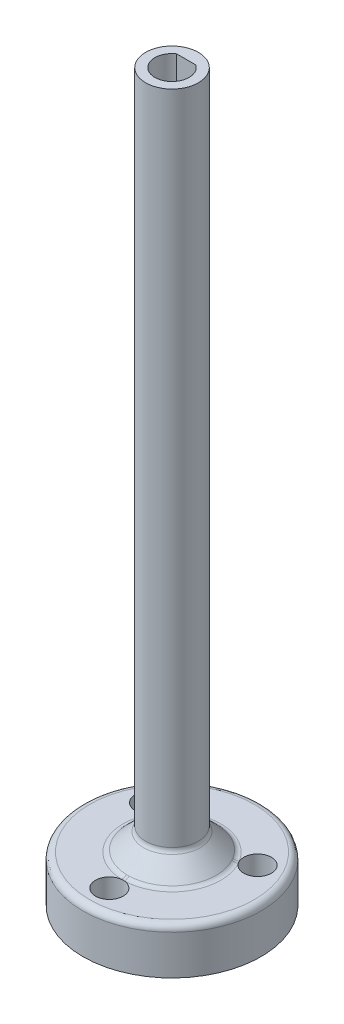
ISO-10303-21;
HEADER;
FILE_DESCRIPTION(('STEP AP214'),'2;1');
FILE_NAME('part.step','',(''),(''),'','','');
FILE_SCHEMA(('AUTOMOTIVE_DESIGN { 1 0 10303 214 1 1 1 1 }'));
ENDSEC;
DATA;
#1=APPLICATION_CONTEXT('core data for automotive mechanical design processes');
#2=APPLICATION_PROTOCOL_DEFINITION('international standard','automotive_design',2000,#1);
#3=PRODUCT_CONTEXT('',#1,'mechanical');
#4=PRODUCT('Part','Part','',(#3));
#5=PRODUCT_RELATED_PRODUCT_CATEGORY('part','',(#4));
#6=PRODUCT_DEFINITION_FORMATION('','',#4);
#7=PRODUCT_DEFINITION_CONTEXT('part definition',#1,'design');
#8=PRODUCT_DEFINITION('design','',#6,#7);
#9=PRODUCT_DEFINITION_SHAPE('','',#8);
#10=(LENGTH_UNIT() NAMED_UNIT(*) SI_UNIT(.MILLI.,.METRE.));
#11=(NAMED_UNIT(*) PLANE_ANGLE_UNIT() SI_UNIT($,.RADIAN.));
#12=(NAMED_UNIT(*) SI_UNIT($,.STERADIAN.) SOLID_ANGLE_UNIT());
#13=UNCERTAINTY_MEASURE_WITH_UNIT(LENGTH_MEASURE(1.E-05),#10,'distance_accuracy_value','');
#14=(GEOMETRIC_REPRESENTATION_CONTEXT(3) GLOBAL_UNCERTAINTY_ASSIGNED_CONTEXT((#13)) GLOBAL_UNIT_ASSIGNED_CONTEXT((#10,
#11,#12)) REPRESENTATION_CONTEXT('',''));
#15=CARTESIAN_POINT('',(0.,0.,0.));
#16=DIRECTION('',(0.,0.,1.));
#17=DIRECTION('',(1.,0.,0.));
#18=AXIS2_PLACEMENT_3D('',#15,#16,#17);
#19=CARTESIAN_POINT('',(-8.22724133595217,7.,-4.75));
#20=DIRECTION('',(0.,-1.,0.));
#21=DIRECTION('',(0.,0.,-1.));
#22=AXIS2_PLACEMENT_3D('',#19,#20,#21);
#23=CYLINDRICAL_SURFACE('',#22,2.1);
#24=CARTESIAN_POINT('',(-8.22724133595217,7.,-4.75));
#25=DIRECTION('',(0.,1.,0.));
#26=DIRECTION('',(0.,0.,1.));
#27=AXIS2_PLACEMENT_3D('',#24,#25,#26);
#28=CIRCLE('',#27,2.1);
#29=CARTESIAN_POINT('',(-6.52591505913718,7.,-3.51894805153525));
#30=VERTEX_POINT('',#29);
#31=CARTESIAN_POINT('',(-6.31045593679587,7.,-3.89213419838459));
#32=VERTEX_POINT('',#31);
#33=EDGE_CURVE('E166',#30,#32,#28,.T.);
#34=ORIENTED_EDGE('',*,*,#33,.T.);
#35=EDGE_CURVE('E165',#32,#30,#28,.T.);
#36=ORIENTED_EDGE('',*,*,#35,.T.);
#37=EDGE_LOOP('',(#34,#36));
#38=FACE_BOUND('',#37,.T.);
#39=CARTESIAN_POINT('',(-8.22724133595217,0.,-4.75));
#40=DIRECTION('',(0.,1.,0.));
#41=DIRECTION('',(0.,0.,1.));
#42=AXIS2_PLACEMENT_3D('',#39,#40,#41);
#43=CIRCLE('',#42,2.1);
#44=CARTESIAN_POINT('',(-8.22724133595217,0.,-2.65));
#45=VERTEX_POINT('',#44);
#46=EDGE_CURVE('E178',#45,#45,#43,.T.);
#47=ORIENTED_EDGE('',*,*,#46,.F.);
#48=EDGE_LOOP('',(#47));
#49=FACE_BOUND('',#48,.T.);
#50=ADVANCED_FACE('F45',(#38,#49),#23,.F.);
#51=CARTESIAN_POINT('',(8.22724133595217,7.,-4.75000000000001));
#52=DIRECTION('',(0.,-1.,0.));
#53=DIRECTION('',(0.,0.,-1.));
#54=AXIS2_PLACEMENT_3D('',#51,#52,#53);
#55=CYLINDRICAL_SURFACE('',#54,2.1);
#56=CARTESIAN_POINT('',(8.22724133595217,7.,-4.75000000000001));
#57=DIRECTION('',(0.,1.,0.));
#58=DIRECTION('',(0.,0.,1.));
#59=AXIS2_PLACEMENT_3D('',#56,#57,#58);
#60=CIRCLE('',#59,2.1);
#61=CARTESIAN_POINT('',(6.31045593679588,7.,-3.89213419838458));
#62=VERTEX_POINT('',#61);
#63=CARTESIAN_POINT('',(6.52591505913716,7.,-3.51894805153528));
#64=VERTEX_POINT('',#63);
#65=EDGE_CURVE('E161',#62,#64,#60,.T.);
#66=ORIENTED_EDGE('',*,*,#65,.T.);
#67=EDGE_CURVE('E159',#64,#62,#60,.T.);
#68=ORIENTED_EDGE('',*,*,#67,.T.);
#69=EDGE_LOOP('',(#66,#68));
#70=FACE_BOUND('',#69,.T.);
#71=CARTESIAN_POINT('',(8.22724133595217,0.,-4.75000000000001));
#72=DIRECTION('',(0.,1.,0.));
#73=DIRECTION('',(0.,0.,1.));
#74=AXIS2_PLACEMENT_3D('',#71,#72,#73);
#75=CIRCLE('',#74,2.1);
#76=CARTESIAN_POINT('',(8.22724133595217,0.,-2.65000000000001));
#77=VERTEX_POINT('',#76);
#78=EDGE_CURVE('E174',#77,#77,#75,.T.);
#79=ORIENTED_EDGE('',*,*,#78,.F.);
#80=EDGE_LOOP('',(#79));
#81=FACE_BOUND('',#80,.T.);
#82=ADVANCED_FACE('F380',(#70,#81),#55,.F.);
#83=CARTESIAN_POINT('',(0.,7.,9.5));
#84=DIRECTION('',(0.,-1.,0.));
#85=DIRECTION('',(0.,0.,-1.));
#86=AXIS2_PLACEMENT_3D('',#83,#84,#85);
#87=CYLINDRICAL_SURFACE('',#86,2.1);
#88=CARTESIAN_POINT('',(0.,7.,9.5));
#89=DIRECTION('',(0.,1.,0.));
#90=DIRECTION('',(0.,0.,1.));
#91=AXIS2_PLACEMENT_3D('',#88,#89,#90);
#92=CIRCLE('',#91,2.1);
#93=CARTESIAN_POINT('',(0.215459122341307,7.,7.41108224991985));
#94=VERTEX_POINT('',#93);
#95=CARTESIAN_POINT('',(-0.215459122341307,7.,7.41108224991985));
#96=VERTEX_POINT('',#95);
#97=EDGE_CURVE('E155',#94,#96,#92,.T.);
#98=ORIENTED_EDGE('',*,*,#97,.T.);
#99=EDGE_CURVE('E160',#96,#94,#92,.T.);
#100=ORIENTED_EDGE('',*,*,#99,.T.);
#101=EDGE_LOOP('',(#98,#100));
#102=FACE_BOUND('',#101,.T.);
#103=CARTESIAN_POINT('',(0.,0.,9.5));
#104=DIRECTION('',(0.,1.,0.));
#105=DIRECTION('',(0.,0.,1.));
#106=AXIS2_PLACEMENT_3D('',#103,#104,#105);
#107=CIRCLE('',#106,2.1);
#108=CARTESIAN_POINT('',(0.,0.,11.6));
#109=VERTEX_POINT('',#108);
#110=EDGE_CURVE('E154',#109,#109,#107,.T.);
#111=ORIENTED_EDGE('',*,*,#110,.F.);
#112=EDGE_LOOP('',(#111));
#113=FACE_BOUND('',#112,.T.);
#114=ADVANCED_FACE('F387',(#102,#113),#87,.F.);
#115=CARTESIAN_POINT('',(0.,7.,0.));
#116=DIRECTION('',(0.,-1.,0.));
#117=DIRECTION('',(0.,0.,-1.));
#118=AXIS2_PLACEMENT_3D('',#115,#116,#117);
#119=CYLINDRICAL_SURFACE('',#118,13.5);
#120=CARTESIAN_POINT('',(0.,6.,0.));
#121=DIRECTION('',(0.,1.,0.));
#122=DIRECTION('',(0.,0.,1.));
#123=AXIS2_PLACEMENT_3D('',#120,#121,#122);
#124=CIRCLE('',#123,13.5);
#125=CARTESIAN_POINT('',(0.,6.,13.5));
#126=VERTEX_POINT('',#125);
#127=EDGE_CURVE('E198',#126,#126,#124,.F.);
#128=ORIENTED_EDGE('',*,*,#127,.T.);
#129=EDGE_LOOP('',(#128));
#130=FACE_BOUND('',#129,.T.);
#131=CARTESIAN_POINT('',(0.,0.,0.));
#132=DIRECTION('',(0.,1.,0.));
#133=DIRECTION('',(0.,0.,1.));
#134=AXIS2_PLACEMENT_3D('',#131,#132,#133);
#135=CIRCLE('',#134,13.5);
#136=CARTESIAN_POINT('',(0.,0.,13.5));
#137=VERTEX_POINT('',#136);
#138=EDGE_CURVE('E182',#137,#137,#135,.T.);
#139=ORIENTED_EDGE('',*,*,#138,.T.);
#140=EDGE_LOOP('',(#139));
#141=FACE_BOUND('',#140,.T.);
#142=ADVANCED_FACE('F425',(#130,#141),#119,.T.);
#143=CARTESIAN_POINT('',(0.,7.,0.));
#144=DIRECTION('',(0.,1.,0.));
#145=DIRECTION('',(0.,0.,1.));
#146=AXIS2_PLACEMENT_3D('',#143,#144,#145);
#147=PLANE('',#146);
#148=CARTESIAN_POINT('',(0.,7.,0.));
#149=DIRECTION('',(0.,1.,0.));
#150=DIRECTION('',(0.,0.,1.));
#151=AXIS2_PLACEMENT_3D('',#148,#149,#150);
#152=CIRCLE('',#151,12.5);
#153=CARTESIAN_POINT('',(0.,7.,12.5));
#154=VERTEX_POINT('',#153);
#155=EDGE_CURVE('E194',#154,#154,#152,.T.);
#156=ORIENTED_EDGE('',*,*,#155,.T.);
#157=EDGE_LOOP('',(#156));
#158=FACE_BOUND('',#157,.T.);
#159=ORIENTED_EDGE('',*,*,#99,.F.);
#160=CARTESIAN_POINT('',(0.,7.,0.));
#161=DIRECTION('',(0.,1.,0.));
#162=DIRECTION('',(0.,0.,1.));
#163=AXIS2_PLACEMENT_3D('',#160,#161,#162);
#164=CIRCLE('',#163,7.4142135623731);
#165=EDGE_CURVE('E191',#96,#30,#164,.F.);
#166=ORIENTED_EDGE('',*,*,#165,.T.);
#167=ORIENTED_EDGE('',*,*,#35,.F.);
#168=CARTESIAN_POINT('',(0.,7.,0.));
#169=DIRECTION('',(0.,1.,0.));
#170=DIRECTION('',(0.,0.,1.));
#171=AXIS2_PLACEMENT_3D('',#168,#169,#170);
#172=CIRCLE('',#171,7.4142135623731);
#173=EDGE_CURVE('E188',#32,#62,#172,.F.);
#174=ORIENTED_EDGE('',*,*,#173,.T.);
#175=ORIENTED_EDGE('',*,*,#67,.F.);
#176=CARTESIAN_POINT('',(0.,7.,0.));
#177=DIRECTION('',(0.,1.,0.));
#178=DIRECTION('',(0.,0.,1.));
#179=AXIS2_PLACEMENT_3D('',#176,#177,#178);
#180=CIRCLE('',#179,7.4142135623731);
#181=EDGE_CURVE('E170',#64,#94,#180,.F.);
#182=ORIENTED_EDGE('',*,*,#181,.T.);
#183=EDGE_LOOP('',(#159,#166,#167,#174,#175,#182));
#184=FACE_BOUND('',#183,.T.);
#185=ADVANCED_FACE('F377',(#158,#184),#147,.T.);
#186=CARTESIAN_POINT('',(0.,0.,0.));
#187=DIRECTION('',(0.,1.,0.));
#188=DIRECTION('',(0.,0.,1.));
#189=AXIS2_PLACEMENT_3D('',#186,#187,#188);
#190=PLANE('',#189);
#191=ORIENTED_EDGE('',*,*,#110,.T.);
#192=EDGE_LOOP('',(#191));
#193=FACE_BOUND('',#192,.T.);
#194=ORIENTED_EDGE('',*,*,#78,.T.);
#195=EDGE_LOOP('',(#194));
#196=FACE_BOUND('',#195,.T.);
#197=ORIENTED_EDGE('',*,*,#46,.T.);
#198=EDGE_LOOP('',(#197));
#199=FACE_BOUND('',#198,.T.);
#200=ORIENTED_EDGE('',*,*,#138,.F.);
#201=EDGE_LOOP('',(#200));
#202=FACE_BOUND('',#201,.T.);
#203=ADVANCED_FACE('F437',(#193,#196,#199,#202),#190,.F.);
#204=CARTESIAN_POINT('',(0.,110.,0.));
#205=DIRECTION('',(0.,-1.,0.));
#206=DIRECTION('',(0.,0.,-1.));
#207=AXIS2_PLACEMENT_3D('',#204,#205,#206);
#208=CYLINDRICAL_SURFACE('',#207,4.);
#209=CARTESIAN_POINT('',(0.,10.4142135623731,0.));
#210=DIRECTION('',(0.,1.,0.));
#211=DIRECTION('',(0.,0.,1.));
#212=AXIS2_PLACEMENT_3D('',#209,#210,#211);
#213=CIRCLE('',#212,4.);
#214=CARTESIAN_POINT('',(0.,10.4142135623731,4.));
#215=VERTEX_POINT('',#214);
#216=EDGE_CURVE('E332',#215,#215,#213,.T.);
#217=ORIENTED_EDGE('',*,*,#216,.T.);
#218=EDGE_LOOP('',(#217));
#219=FACE_BOUND('',#218,.T.);
#220=CARTESIAN_POINT('',(0.,110.,0.));
#221=DIRECTION('',(0.,1.,0.));
#222=DIRECTION('',(0.,0.,1.));
#223=AXIS2_PLACEMENT_3D('',#220,#221,#222);
#224=CIRCLE('',#223,4.);
#225=CARTESIAN_POINT('',(0.,110.,4.));
#226=VERTEX_POINT('',#225);
#227=EDGE_CURVE('E131',#226,#226,#224,.T.);
#228=ORIENTED_EDGE('',*,*,#227,.F.);
#229=EDGE_LOOP('',(#228));
#230=FACE_BOUND('',#229,.T.);
#231=ADVANCED_FACE('F444',(#219,#230),#208,.T.);
#232=CARTESIAN_POINT('',(0.,110.,0.));
#233=DIRECTION('',(0.,1.,0.));
#234=DIRECTION('',(0.,0.,1.));
#235=AXIS2_PLACEMENT_3D('',#232,#233,#234);
#236=PLANE('',#235);
#237=CARTESIAN_POINT('',(0.,110.,0.));
#238=DIRECTION('',(0.,1.,0.));
#239=DIRECTION('',(0.,0.,1.));
#240=AXIS2_PLACEMENT_3D('',#237,#238,#239);
#241=CIRCLE('',#240,2.6);
#242=CARTESIAN_POINT('',(-1.46201915172134,110.,-2.15));
#243=VERTEX_POINT('',#242);
#244=CARTESIAN_POINT('',(1.46201915172134,110.,-2.15));
#245=VERTEX_POINT('',#244);
#246=EDGE_CURVE('E126',#243,#245,#241,.T.);
#247=ORIENTED_EDGE('',*,*,#246,.F.);
#248=DIRECTION('',(-1.,0.,0.));
#249=VECTOR('',#248,1.);
#250=CARTESIAN_POINT('',(-1.46201915172134,110.,-2.15));
#251=LINE('',#250,#249);
#252=EDGE_CURVE('E134',#245,#243,#251,.T.);
#253=ORIENTED_EDGE('',*,*,#252,.F.);
#254=EDGE_LOOP('',(#247,#253));
#255=FACE_BOUND('',#254,.T.);
#256=ORIENTED_EDGE('',*,*,#227,.T.);
#257=EDGE_LOOP('',(#256));
#258=FACE_BOUND('',#257,.T.);
#259=ADVANCED_FACE('F139',(#255,#258),#236,.T.);
#260=CARTESIAN_POINT('',(0.,93.,0.));
#261=DIRECTION('',(0.,1.,0.));
#262=DIRECTION('',(0.,0.,1.));
#263=AXIS2_PLACEMENT_3D('',#260,#261,#262);
#264=CYLINDRICAL_SURFACE('',#263,2.6);
#265=DIRECTION('',(0.,1.,0.));
#266=VECTOR('',#265,1.);
#267=CARTESIAN_POINT('',(1.46201915172134,93.,-2.15));
#268=LINE('',#267,#266);
#269=CARTESIAN_POINT('',(1.46201915172134,95.,-2.15));
#270=VERTEX_POINT('',#269);
#271=EDGE_CURVE('E132',#270,#245,#268,.T.);
#272=ORIENTED_EDGE('',*,*,#271,.F.);
#273=CARTESIAN_POINT('',(0.,95.,0.));
#274=DIRECTION('',(0.,1.,0.));
#275=DIRECTION('',(0.,0.,1.));
#276=AXIS2_PLACEMENT_3D('',#273,#274,#275);
#277=CIRCLE('',#276,2.6);
#278=CARTESIAN_POINT('',(-1.46201915172134,95.,-2.15));
#279=VERTEX_POINT('',#278);
#280=EDGE_CURVE('E11',#270,#279,#277,.F.);
#281=ORIENTED_EDGE('',*,*,#280,.T.);
#282=DIRECTION('',(0.,1.,0.));
#283=VECTOR('',#282,1.);
#284=CARTESIAN_POINT('',(-1.46201915172134,93.,-2.15));
#285=LINE('',#284,#283);
#286=EDGE_CURVE('E122',#279,#243,#285,.T.);
#287=ORIENTED_EDGE('',*,*,#286,.T.);
#288=ORIENTED_EDGE('',*,*,#246,.T.);
#289=EDGE_LOOP('',(#272,#281,#287,#288));
#290=FACE_BOUND('',#289,.T.);
#291=ADVANCED_FACE('F124',(#290),#264,.F.);
#292=CARTESIAN_POINT('',(-1.46201915172134,93.,-2.15));
#293=DIRECTION('',(0.,0.,-1.));
#294=DIRECTION('',(-1.,0.,0.));
#295=AXIS2_PLACEMENT_3D('',#292,#293,#294);
#296=PLANE('',#295);
#297=ORIENTED_EDGE('',*,*,#286,.F.);
#298=DIRECTION('',(1.,0.,0.));
#299=VECTOR('',#298,1.);
#300=CARTESIAN_POINT('',(-1.46201915172134,95.,-2.15));
#301=LINE('',#300,#299);
#302=EDGE_CURVE('E61',#279,#270,#301,.T.);
#303=ORIENTED_EDGE('',*,*,#302,.T.);
#304=ORIENTED_EDGE('',*,*,#271,.T.);
#305=ORIENTED_EDGE('',*,*,#252,.T.);
#306=EDGE_LOOP('',(#297,#303,#304,#305));
#307=FACE_BOUND('',#306,.T.);
#308=ADVANCED_FACE('F135',(#307),#296,.F.);
#309=CARTESIAN_POINT('',(0.,93.,0.));
#310=DIRECTION('',(0.,1.,0.));
#311=DIRECTION('',(0.,0.,1.));
#312=AXIS2_PLACEMENT_3D('',#309,#310,#311);
#313=PLANE('',#312);
#314=CARTESIAN_POINT('',(0.,93.,0.));
#315=DIRECTION('',(0.,1.,0.));
#316=DIRECTION('',(0.,0.,1.));
#317=AXIS2_PLACEMENT_3D('',#314,#315,#316);
#318=CIRCLE('',#317,0.599999999999989);
#319=CARTESIAN_POINT('',(-0.580947501931104,93.,-0.14999999999999));
#320=VERTEX_POINT('',#319);
#321=CARTESIAN_POINT('',(0.580947501931104,93.,-0.14999999999999));
#322=VERTEX_POINT('',#321);
#323=EDGE_CURVE('E302',#320,#322,#318,.T.);
#324=ORIENTED_EDGE('',*,*,#323,.T.);
#325=DIRECTION('',(-1.,0.,0.));
#326=VECTOR('',#325,1.);
#327=CARTESIAN_POINT('',(0.,93.,-0.14999999999999));
#328=LINE('',#327,#326);
#329=EDGE_CURVE('E327',#322,#320,#328,.T.);
#330=ORIENTED_EDGE('',*,*,#329,.T.);
#331=EDGE_LOOP('',(#324,#330));
#332=FACE_BOUND('',#331,.T.);
#333=ADVANCED_FACE('F410',(#332),#313,.T.);
#334=CARTESIAN_POINT('',(0.,10.,0.));
#335=DIRECTION('',(0.,-1.,0.));
#336=DIRECTION('',(0.,0.,-1.));
#337=AXIS2_PLACEMENT_3D('',#334,#335,#336);
#338=CONICAL_SURFACE('',#337,4.,0.785398163397442);
#339=CARTESIAN_POINT('',(0.964392071070711,7.,7.63453814478667));
#340=CARTESIAN_POINT('',(0.940532110188587,6.8546779710934,7.08404741665626));
#341=CARTESIAN_POINT('',(0.993851498928227,7.24966295601321,6.67677387706806));
#342=CARTESIAN_POINT('',(0.939082338416927,7.,7.62145551529444));
#343=CARTESIAN_POINT('',(0.914917325744151,6.8645663279993,7.07731076934834));
#344=CARTESIAN_POINT('',(0.960617892757036,7.25483919760367,6.67648809214324));
#345=CARTESIAN_POINT('',(0.913030160219413,7.,7.60863828458851));
#346=CARTESIAN_POINT('',(0.88844095042153,6.87407031500396,7.07098239734326));
#347=CARTESIAN_POINT('',(0.92733125811109,7.25941775065054,6.67657110362549));
#348=CARTESIAN_POINT('',(0.859405569203017,7.,7.58367585865176));
#349=CARTESIAN_POINT('',(0.834053692634578,6.89215530304134,7.05918543886975));
#350=CARTESIAN_POINT('',(0.860699646128984,7.26749585495772,6.6773422732741));
#351=CARTESIAN_POINT('',(0.831833762021651,7.,7.57153039950276));
#352=CARTESIAN_POINT('',(0.806143549122456,6.90074634958733,7.05370840519843));
#353=CARTESIAN_POINT('',(0.827354697091079,7.27099583246315,6.67803019197036));
#354=CARTESIAN_POINT('',(0.746861309748615,7.,7.53634208754119));
#355=CARTESIAN_POINT('',(0.720741381883771,6.92495083085154,7.03859250005324));
#356=CARTESIAN_POINT('',(0.727389397896839,7.28004637042288,6.6807995102541));
#357=CARTESIAN_POINT('',(0.687109157966461,7.,7.51449728064184));
#358=CARTESIAN_POINT('',(0.660901836105139,6.93924887044047,7.03010051715558));
#359=CARTESIAN_POINT('',(0.66071384834035,7.28416603416479,6.68358639626018));
#360=CARTESIAN_POINT('',(0.561594479589067,7.,7.47542300631635));
#361=CARTESIAN_POINT('',(0.536814808875337,6.96363756519083,7.01613295777335));
#362=CARTESIAN_POINT('',(0.527547947642192,7.28973784129046,6.68982345549574));
#363=CARTESIAN_POINT('',(0.495850145703401,7.,7.45818015456587));
#364=CARTESIAN_POINT('',(0.47247749425604,6.9738140265515,7.01060008892335));
#365=CARTESIAN_POINT('',(0.461057628520458,7.29119779395776,6.69327165395947));
#366=CARTESIAN_POINT('',(0.35907834535312,7.,7.42975257120324));
#367=CARTESIAN_POINT('',(0.340366619795047,6.98997529996355,7.00206100798164));
#368=CARTESIAN_POINT('',(0.328024357396843,7.29277524530763,6.69952973450763));
#369=CARTESIAN_POINT('',(0.288049767910334,7.,7.41856911765748));
#370=CARTESIAN_POINT('',(0.272403067798783,6.99601734798804,6.99902225515107));
#371=CARTESIAN_POINT('',(0.261481397253549,7.29289246088099,6.70233948185553));
#372=CARTESIAN_POINT('',(0.151540897340339,7.,7.40448983993549));
#373=CARTESIAN_POINT('',(0.142908602561365,7.0034937637638,6.99530788228604));
#374=CARTESIAN_POINT('',(0.136292687711151,7.29289388619522,6.70597760226659));
#375=CARTESIAN_POINT('',(0.0864115551324169,7.,7.40076351117429));
#376=CARTESIAN_POINT('',(0.0814147585385162,7.00541447118292,6.99438211212521));
#377=CARTESIAN_POINT('',(0.0776532370722739,7.29280426025577,6.70700258726048));
#378=CARTESIAN_POINT('',(-0.0440911627339864,7.,7.39944971034132));
#379=CARTESIAN_POINT('',(-0.0415270682911661,7.00609537492484,6.99405117420053));
#380=CARTESIAN_POINT('',(-0.0396274419809167,7.29278114017805,6.70735811640296));
#381=CARTESIAN_POINT('',(-0.109464521048752,7.,7.40186180996846));
#382=CARTESIAN_POINT('',(-0.103174539623916,7.00485799464258,6.99464483506416));
#383=CARTESIAN_POINT('',(-0.0982686699857281,7.29284763514661,6.70668877877078));
#384=CARTESIAN_POINT('',(-0.238204997632121,7.,7.41255269912608));
#385=CARTESIAN_POINT('',(-0.224985847829216,6.99922980160129,6.99741968763948));
#386=CARTESIAN_POINT('',(-0.215493067573421,7.2929137268914,6.70387988211979));
#387=CARTESIAN_POINT('',(-0.301572749961868,7.,7.42082961477724));
#388=CARTESIAN_POINT('',(-0.285336251174129,6.99482224246639,6.99960921850319));
#389=CARTESIAN_POINT('',(-0.27407624971714,7.29291334502599,6.70174079271098));
#390=CARTESIAN_POINT('',(-0.424664644222314,7.,7.44243504780572));
#391=CARTESIAN_POINT('',(-0.403454747049731,6.9828421602968,7.00580086606958));
#392=CARTESIAN_POINT('',(-0.391220347553087,7.29216596294367,6.69667245705004));
#393=CARTESIAN_POINT('',(-0.484387802982984,7.,7.45576492134256));
#394=CARTESIAN_POINT('',(-0.461368331777474,6.97523403086884,7.00982246112346));
#395=CARTESIAN_POINT('',(-0.449781253039109,7.29141876220041,6.69374299873229));
#396=CARTESIAN_POINT('',(-0.5996800091924,7.,7.48655134938539));
#397=CARTESIAN_POINT('',(-0.574211254090877,6.95680848325585,7.02000209236644));
#398=CARTESIAN_POINT('',(-0.567309388710926,7.28829339880792,6.68794794295523));
#399=CARTESIAN_POINT('',(-0.655216226033752,7.,7.50403678753922));
#400=CARTESIAN_POINT('',(-0.62921074221499,6.94592147062308,7.02620429313583));
#401=CARTESIAN_POINT('',(-0.626276523826103,7.28590358855339,6.68508295345722));
#402=CARTESIAN_POINT('',(-0.761330809039517,7.,7.54205445056581));
#403=CARTESIAN_POINT('',(-0.735168253128472,6.92107950248601,7.04100052272153));
#404=CARTESIAN_POINT('',(-0.744131217351407,7.2786155610104,6.68032494548362));
#405=CARTESIAN_POINT('',(-0.811912467228869,7.,7.56258462926299));
#406=CARTESIAN_POINT('',(-0.78617776375319,6.90707275055508,7.04963098698742));
#407=CARTESIAN_POINT('',(-0.803018802606971,7.27371902295629,6.67843127802608));
#408=CARTESIAN_POINT('',(-0.908398683643013,7.,7.60589744467528));
#409=CARTESIAN_POINT('',(-0.883891177588462,6.87616474649766,7.06951503888091));
#410=CARTESIAN_POINT('',(-0.920813141430025,7.2606465421496,6.67640732552143));
#411=CARTESIAN_POINT('',(-0.95428832646702,7.,7.62868683702746));
#412=CARTESIAN_POINT('',(-0.930584750400519,6.85920102814364,7.08082056545844));
#413=CARTESIAN_POINT('',(-0.979719393330013,7.25246052568087,6.67628250036391));
#414=CARTESIAN_POINT('',(-1.04163813765772,7.,7.67587307259055));
#415=CARTESIAN_POINT('',(-1.01925859123222,6.82273451613959,7.10613645902736));
#416=CARTESIAN_POINT('',(-1.09722421004048,7.2322374638015,6.67848046599306));
#417=CARTESIAN_POINT('',(-1.08308720295185,7.,7.70027370935831));
#418=CARTESIAN_POINT('',(-1.06119756962471,6.80317645128842,7.1202004000535));
#419=CARTESIAN_POINT('',(-1.15582167058219,7.22019105264382,6.6808092412515));
#420=CARTESIAN_POINT('',(-1.12241801329154,7.,7.72512597533271));
#421=CARTESIAN_POINT('',(-1.10016930486776,6.78272593576934,7.13552863825325));
#422=CARTESIAN_POINT('',(-1.2140474808745,7.20594663198824,6.68470267712591));
#423=(BOUNDED_SURFACE() B_SPLINE_SURFACE(3,2,((#339,#340,#341),(#342,#343,#344),(#345,#346,
#347),(#348,#349,#350),(#351,#352,#353),(#354,#355,#356),(#357,#358,#359),(#360,#361,#362),
(#363,#364,#365),(#366,#367,#368),(#369,#370,#371),(#372,#373,#374),(#375,#376,#377),(#378,#379,
#380),(#381,#382,#383),(#384,#385,#386),(#387,#388,#389),(#390,#391,#392),(#393,#394,#395),
(#396,#397,#398),(#399,#400,#401),(#402,#403,#404),(#405,#406,#407),(#408,#409,#410),(#411,#412,
#413),(#414,#415,#416),(#417,#418,#419),(#420,#421,#422)),.UNSPECIFIED.,.F.,.F.,
.F.) B_SPLINE_SURFACE_WITH_KNOTS((4,2,2,2,2,2,2,2,2,2,2,2,2,4),(3,3),(0.,0.11098229509543,
0.221920674391029,0.443381708865098,0.66419144829289,0.885047743458971,1.0795181859593,
1.27397505990184,1.46836983053275,1.66281681161086,1.8586570200029,2.05436620814021,
2.25067936115262,2.44747244406206),(0.,1.),
.UNSPECIFIED.) GEOMETRIC_REPRESENTATION_ITEM() RATIONAL_B_SPLINE_SURFACE(((1.,0.868833723733503,
1.),(1.,0.872056317625261,1.),(1.,0.875215910586562,1.),(1.,0.881371794726937,1.),(1.,
0.884368150029956,1.),(1.,0.893049367142333,1.),(1.,0.898438720063319,1.),(1.,0.908068623797281,
1.),(1.,0.912312506511905,1.),(1.,0.919300308313608,1.),(1.,0.922043910958253,1.),(1.,
0.925495851949209,1.),(1.,0.926408184602559,1.),(1.,0.9267299709252,1.),(1.,0.92613952944866,
1.),(1.,0.923519271882411,1.),(1.,0.921489915543182,1.),(1.,0.916183801421887,1.),(1.,
0.912906708759772,1.),(1.,0.905327080351575,1.),(1.,0.901017365468694,1.),(1.,0.891640773424152,
1.),(1.,0.886574404745208,1.),(1.,0.875891084036162,1.),(1.,0.870272481138102,1.),(1.,
0.858657537521036,1.),(1.,0.852660306920697,1.),(1.,0.846567981025701,1.))) REPRESENTATION_ITEM('') SURFACE());
#424=CARTESIAN_POINT('',(-1.2140474808745,7.20594663198824,6.68470267712591));
#425=CARTESIAN_POINT('',(-1.15582167058219,7.22019105264382,6.6808092412515));
#426=CARTESIAN_POINT('',(-1.09722421004048,7.2322374638015,6.67848046599306));
#427=CARTESIAN_POINT('',(-0.979719393330013,7.25246052568087,6.67628250036391));
#428=CARTESIAN_POINT('',(-0.920813141430025,7.2606465421496,6.67640732552143));
#429=CARTESIAN_POINT('',(-0.803018802606971,7.27371902295629,6.67843127802608));
#430=CARTESIAN_POINT('',(-0.744131217351407,7.2786155610104,6.68032494548362));
#431=CARTESIAN_POINT('',(-0.626276523826103,7.28590358855339,6.68508295345722));
#432=CARTESIAN_POINT('',(-0.567309388710926,7.28829339880792,6.68794794295523));
#433=CARTESIAN_POINT('',(-0.449781253039109,7.29141876220041,6.69374299873229));
#434=CARTESIAN_POINT('',(-0.391220347553087,7.29216596294367,6.69667245705004));
#435=CARTESIAN_POINT('',(-0.27407624971714,7.29291334502599,6.70174079271098));
#436=CARTESIAN_POINT('',(-0.215493067573421,7.2929137268914,6.70387988211979));
#437=CARTESIAN_POINT('',(-0.0982686699857281,7.29284763514661,6.70668877877078));
#438=CARTESIAN_POINT('',(-0.0396274419809166,7.29278114017805,6.70735811640296));
#439=CARTESIAN_POINT('',(0.0776532370722739,7.29280426025577,6.70700258726048));
#440=CARTESIAN_POINT('',(0.136292687711151,7.29289388619522,6.70597760226659));
#441=CARTESIAN_POINT('',(0.261481397253549,7.29289246088099,6.70233948185553));
#442=CARTESIAN_POINT('',(0.328024357396843,7.29277524530762,6.69952973450763));
#443=CARTESIAN_POINT('',(0.461057628520458,7.29119779395776,6.69327165395947));
#444=CARTESIAN_POINT('',(0.527547947642192,7.28973784129046,6.68982345549574));
#445=CARTESIAN_POINT('',(0.66071384834035,7.28416603416479,6.68358639626018));
#446=CARTESIAN_POINT('',(0.72738939789684,7.28004637042288,6.6807995102541));
#447=CARTESIAN_POINT('',(0.827354697091079,7.27099583246315,6.67803019197036));
#448=CARTESIAN_POINT('',(0.860699646128984,7.26749585495772,6.6773422732741));
#449=CARTESIAN_POINT('',(0.92733125811109,7.25941775065054,6.67657110362549));
#450=CARTESIAN_POINT('',(0.960617892757036,7.25483919760367,6.67648809214324));
#451=CARTESIAN_POINT('',(0.993851498928227,7.24966295601321,6.67677387706806));
#452=B_SPLINE_CURVE_WITH_KNOTS('',3,(#424,#425,#426,#427,#428,#429,#430,#431,#432,#433,#434,
#435,#436,#437,#438,#439,#440,#441,#442,#443,#444,#445,#446,#447,#448,#449,#450,#451),
.UNSPECIFIED.,.F.,.F.,(4,2,2,2,2,2,2,2,2,2,2,2,2,4),(0.,0.196793082909443,0.393106235921857,
0.588815424059163,0.784655632451207,0.979102613529312,1.17349738416022,1.36795425810276,
1.56242470060309,1.78328099576917,2.00409073519697,2.22555176967104,2.33649014896663,
2.44747244406206),.UNSPECIFIED.);
#453=CARTESIAN_POINT('',(-0.194910401267338,7.29289321881346,6.70427410759109));
#454=VERTEX_POINT('',#453);
#455=CARTESIAN_POINT('',(0.194910401267338,7.29289321881346,6.70427410759109));
#456=VERTEX_POINT('',#455);
#457=EDGE_CURVE('E206',#454,#456,#452,.T.);
#458=ORIENTED_EDGE('',*,*,#457,.T.);
#459=CARTESIAN_POINT('',(0.,7.29289321881346,0.));
#460=DIRECTION('',(0.,1.,0.));
#461=DIRECTION('',(0.,0.,1.));
#462=AXIS2_PLACEMENT_3D('',#459,#460,#461);
#463=CIRCLE('',#462,6.70710678118655);
#464=CARTESIAN_POINT('',(5.90352689174179,7.29289321881346,-3.18333969483624));
#465=VERTEX_POINT('',#464);
#466=EDGE_CURVE('E336',#456,#465,#463,.T.);
#467=ORIENTED_EDGE('',*,*,#466,.T.);
#468=CARTESIAN_POINT('',(6.11659052111849,7.28394758029571,-2.77356818938697));
#469=CARTESIAN_POINT('',(6.41608097702233,6.93952910892417,-2.94708908068522));
#470=CARTESIAN_POINT('',(6.84822152966271,7.,-3.16623727349664));
#471=CARTESIAN_POINT('',(6.10278797080369,7.28559096471843,-2.80002813887492));
#472=CARTESIAN_POINT('',(6.39949459902322,6.94553980813328,-2.96874599620548));
#473=CARTESIAN_POINT('',(6.8264993550231,7.,-3.18515123684236));
#474=CARTESIAN_POINT('',(6.08907653691353,7.28692954333689,-2.82654428296588));
#475=CARTESIAN_POINT('',(6.38287813153219,6.95116499720948,-2.99104587457929));
#476=CARTESIAN_POINT('',(6.80481636362785,7.,-3.20481747854823));
#477=CARTESIAN_POINT('',(6.06173635467157,7.28911226504215,-2.87962777929882));
#478=CARTESIAN_POINT('',(6.34970360290342,6.96159038875434,-3.03670269639448));
#479=CARTESIAN_POINT('',(6.7616748842975,7.,-3.24567345688471));
#480=CARTESIAN_POINT('',(6.04810759895169,7.28995645284806,-2.90619512669113));
#481=CARTESIAN_POINT('',(6.33313661939681,6.96639716865946,-3.06006659825741));
#482=CARTESIAN_POINT('',(6.74021637622973,7.,-3.26686305552843));
#483=CARTESIAN_POINT('',(6.00718403227892,7.29192090969748,-2.98590561957786));
#484=CARTESIAN_POINT('',(6.28362349145445,6.97954241798248,-3.13148317222222));
#485=CARTESIAN_POINT('',(6.67637786722707,7.,-3.33276401401267));
#486=CARTESIAN_POINT('',(5.97986021378065,7.29247221076317,-3.03904101257426));
#487=CARTESIAN_POINT('',(6.2506160756274,6.98668978670781,-3.18119674146452));
#488=CARTESIAN_POINT('',(6.63454830044871,7.,-3.37979603088607));
#489=CARTESIAN_POINT('',(5.92438812395607,7.29296134429307,-3.14476561672366));
#490=CARTESIAN_POINT('',(6.18518378968276,6.99762229920462,-3.28335346179448));
#491=CARTESIAN_POINT('',(6.55390448828796,7.,-3.47955085922943));
#492=CARTESIAN_POINT('',(5.89624136226592,7.29290023744295,-3.19735561435536));
#493=CARTESIAN_POINT('',(6.15266093348185,7.00144671232343,-3.33592407245777));
#494=CARTESIAN_POINT('',(6.51508514673334,7.,-3.53226367495628));
#495=CARTESIAN_POINT('',(5.83853434970674,7.29280699647612,-3.301743508152));
#496=CARTESIAN_POINT('',(6.08861991656352,7.00580446579448,-3.44257601917396));
#497=CARTESIAN_POINT('',(6.44201810630413,7.,-3.642153128636));
#498=CARTESIAN_POINT('',(5.80897442060652,7.29277485579679,-3.35354158112126));
#499=CARTESIAN_POINT('',(6.05699455715048,7.00635292780433,-3.49682814768236));
#500=CARTESIAN_POINT('',(6.40776937340269,7.,-3.69932875229544));
#501=CARTESIAN_POINT('',(5.74838139771618,7.29284323795573,-3.45624317433472));
#502=CARTESIAN_POINT('',(5.99548227789431,7.00418894933408,-3.6054771885572));
#503=CARTESIAN_POINT('',(6.34515327682982,7.,-3.81611754364611));
#504=CARTESIAN_POINT('',(5.71734879294981,7.29294371704872,-3.50714698394473));
#505=CARTESIAN_POINT('',(5.96549389755191,7.0014703703398,-3.66005579711692));
#506=CARTESIAN_POINT('',(6.3167839773695,7.,-3.87572990128468));
#507=CARTESIAN_POINT('',(5.6542294569666,7.29279434944045,-3.60830320048392));
#508=CARTESIAN_POINT('',(5.90806747779666,6.99276710002964,-3.76826340419182));
#509=CARTESIAN_POINT('',(6.26647694005656,7.,-3.99526975162914));
#510=CARTESIAN_POINT('',(5.62214254721899,7.29254444310499,-3.65855549505862));
#511=CARTESIAN_POINT('',(5.88055280719248,6.98675435134871,-3.82205415637218));
#512=CARTESIAN_POINT('',(6.24454029778491,7.,-4.05519729624908));
#513=CARTESIAN_POINT('',(5.55757669547061,7.29084625762197,-3.75894292104772));
#514=CARTESIAN_POINT('',(5.82877817687466,6.97144359448743,-3.92804471133541));
#515=CARTESIAN_POINT('',(6.20688145379978,7.,-4.17377818967886));
#516=CARTESIAN_POINT('',(5.52509710063731,7.28939559580868,-3.80907762059636));
#517=CARTESIAN_POINT('',(5.80448219468496,6.96209564361473,-3.98036517132809));
#518=CARTESIAN_POINT('',(6.19117169987076,7.,-4.23242876691783));
#519=CARTESIAN_POINT('',(5.47673822530163,7.28562132606353,-3.88447029094125));
#520=CARTESIAN_POINT('',(5.7710609082384,6.94570033289825,-4.05704536089321));
#521=CARTESIAN_POINT('',(6.17182823405872,7.,-4.31855530454161));
#522=CARTESIAN_POINT('',(5.46067822851339,7.28409678964766,-3.90963367946134));
#523=CARTESIAN_POINT('',(5.76038246491835,6.93981005472634,-4.08241336078732));
#524=CARTESIAN_POINT('',(6.16608383487527,7.,-4.34695672122395));
#525=CARTESIAN_POINT('',(5.42877522916559,7.28040785373437,-3.96007653572652));
#526=CARTESIAN_POINT('',(5.74006115455348,6.92723814489969,-4.13258735870238));
#527=CARTESIAN_POINT('',(6.15589983505867,7.,-4.40307528054329));
#528=CARTESIAN_POINT('',(5.41293226599969,7.27824333964379,-3.98535602346138));
#529=CARTESIAN_POINT('',(5.73041955781102,6.92054941731537,-4.15740120003841));
#530=CARTESIAN_POINT('',(6.15146046838626,7.,-4.43079229966952));
#531=CARTESIAN_POINT('',(5.39724897285713,7.27570554776031,-4.01071557273937));
#532=CARTESIAN_POINT('',(5.72135695968629,6.91349588176136,-4.18183539815925));
#533=CARTESIAN_POINT('',(6.14762334850777,7.,-4.45812840786109));
#534=(BOUNDED_SURFACE() B_SPLINE_SURFACE(3,2,((#468,#469,#470),(#471,#472,#473),(#474,#475,
#476),(#477,#478,#479),(#480,#481,#482),(#483,#484,#485),(#486,#487,#488),(#489,#490,#491),
(#492,#493,#494),(#495,#496,#497),(#498,#499,#500),(#501,#502,#503),(#504,#505,#506),(#507,#508,
#509),(#510,#511,#512),(#513,#514,#515),(#516,#517,#518),(#519,#520,#521),(#522,#523,#524),
(#525,#526,#527),(#528,#529,#530),(#531,#532,#533)),.UNSPECIFIED.,.F.,.F.,
.F.) B_SPLINE_SURFACE_WITH_KNOTS((4,2,2,2,2,2,2,2,2,2,4),(3,3),(0.,0.0990480088502725,
0.198087057130333,0.396225539185468,0.59402090634777,0.791771449349362,0.989456779673371,
1.18717575933648,1.38528801705362,1.48434985818808,1.58342944789827),(0.,1.),
.UNSPECIFIED.) GEOMETRIC_REPRESENTATION_ITEM() RATIONAL_B_SPLINE_SURFACE(((1.,0.89859624267044,
1.),(1.,0.90090316907885,1.),(1.,0.903108022326377,1.),(1.,0.907280060486465,1.),(1.,
0.909247266882106,1.),(1.,0.914743861627652,1.),(1.,0.917866778422494,1.),(1.,0.922767067899898,
1.),(1.,0.924546761286026,1.),(1.,0.926588596208628,1.),(1.,0.926851081559575,1.),(1.,
0.925830298889109,1.),(1.,0.924547540586,1.),(1.,0.920573121742182,1.),(1.,0.917881221419988,
1.),(1.,0.91132167700991,1.),(1.,0.907451704928755,1.),(1.,0.900967189698637,1.),(1.,
0.898692349720574,1.),(1.,0.893947132362814,1.),(1.,0.891476720022365,1.),(1.,0.888924420616177,1.))) REPRESENTATION_ITEM('') SURFACE());
#535=CARTESIAN_POINT('',(6.11659052111849,7.28394758029571,-2.77356818938697));
#536=CARTESIAN_POINT('',(6.10278797080369,7.28559096471843,-2.80002813887492));
#537=CARTESIAN_POINT('',(6.08907653691353,7.28692954333689,-2.82654428296588));
#538=CARTESIAN_POINT('',(6.06173635467157,7.28911226504215,-2.87962777929882));
#539=CARTESIAN_POINT('',(6.04810759895169,7.28995645284806,-2.90619512669113));
#540=CARTESIAN_POINT('',(6.00718403227892,7.29192090969749,-2.98590561957786));
#541=CARTESIAN_POINT('',(5.97986021378066,7.29247221076317,-3.03904101257426));
#542=CARTESIAN_POINT('',(5.92438812395607,7.29296134429307,-3.14476561672366));
#543=CARTESIAN_POINT('',(5.89624136226592,7.29290023744294,-3.19735561435536));
#544=CARTESIAN_POINT('',(5.83853434970674,7.29280699647612,-3.301743508152));
#545=CARTESIAN_POINT('',(5.80897442060652,7.29277485579679,-3.35354158112126));
#546=CARTESIAN_POINT('',(5.74838139771618,7.29284323795573,-3.45624317433472));
#547=CARTESIAN_POINT('',(5.71734879294981,7.29294371704872,-3.50714698394473));
#548=CARTESIAN_POINT('',(5.6542294569666,7.29279434944045,-3.60830320048392));
#549=CARTESIAN_POINT('',(5.62214254721899,7.29254444310499,-3.65855549505862));
#550=CARTESIAN_POINT('',(5.55757669547061,7.29084625762197,-3.75894292104772));
#551=CARTESIAN_POINT('',(5.52509710063731,7.28939559580868,-3.80907762059636));
#552=CARTESIAN_POINT('',(5.47673822530163,7.28562132606353,-3.88447029094125));
#553=CARTESIAN_POINT('',(5.46067822851339,7.28409678964766,-3.90963367946134));
#554=CARTESIAN_POINT('',(5.42877522916559,7.28040785373437,-3.96007653572652));
#555=CARTESIAN_POINT('',(5.41293226599969,7.27824333964379,-3.98535602346138));
#556=CARTESIAN_POINT('',(5.39724897285713,7.27570554776031,-4.01071557273937));
#557=B_SPLINE_CURVE_WITH_KNOTS('',3,(#535,#536,#537,#538,#539,#540,#541,#542,#543,#544,#545,
#546,#547,#548,#549,#550,#551,#552,#553,#554,#555,#556),.UNSPECIFIED.,.F.,.F.,(4,2,2,2,2,2,2,2,
2,2,4),(0.,0.0990480088502725,0.198087057130333,0.396225539185468,0.59402090634777,
0.791771449349362,0.989456779673371,1.18717575933648,1.38528801705362,1.48434985818808,
1.58342944789827),.UNSPECIFIED.);
#558=CARTESIAN_POINT('',(5.70861649047448,7.29289321881346,-3.52093441275486));
#559=VERTEX_POINT('',#558);
#560=EDGE_CURVE('E341',#465,#559,#557,.T.);
#561=ORIENTED_EDGE('',*,*,#560,.T.);
#562=CARTESIAN_POINT('',(0.,7.29289321881346,0.));
#563=DIRECTION('',(0.,1.,0.));
#564=DIRECTION('',(0.,0.,1.));
#565=AXIS2_PLACEMENT_3D('',#562,#563,#564);
#566=CIRCLE('',#565,6.70710678118655);
#567=CARTESIAN_POINT('',(-5.70861649047447,7.29289321881346,-3.52093441275488));
#568=VERTEX_POINT('',#567);
#569=EDGE_CURVE('E372',#559,#568,#566,.T.);
#570=ORIENTED_EDGE('',*,*,#569,.T.);
#571=CARTESIAN_POINT('',(-6.91736473515814,7.,-3.10859106536723));
#572=CARTESIAN_POINT('',(-6.46899988720526,6.91903638961199,-2.88005249339311));
#573=CARTESIAN_POINT('',(-6.16081290173443,7.27764464958707,-2.68969251905268));
#574=CARTESIAN_POINT('',(-6.88082670211137,7.,-3.13774038622707));
#575=CARTESIAN_POINT('',(-6.44113758538695,6.93053130644093,-2.91421721222753));
#576=CARTESIAN_POINT('',(-6.13720771893751,7.28159038781743,-2.73390289577445));
#577=CARTESIAN_POINT('',(-6.84419464375536,7.,-3.16897955812591));
#578=CARTESIAN_POINT('',(-6.4131415983041,6.94097245555924,-2.95037082887125));
#579=CARTESIAN_POINT('',(-6.11400401722828,7.284508928984,-2.7783614899782));
#580=CARTESIAN_POINT('',(-6.77143144808644,7.,-3.23571862772638));
#581=CARTESIAN_POINT('',(-6.35732577291352,6.95952651154622,-3.02573655844934));
#582=CARTESIAN_POINT('',(-6.06793398819611,7.28883130229596,-2.86748468038151));
#583=CARTESIAN_POINT('',(-6.73530020134563,7.,-3.27121757775318));
#584=CARTESIAN_POINT('',(-6.32946555808698,6.96767156377315,-3.06497599721534));
#585=CARTESIAN_POINT('',(-6.04506758710019,7.2902354706529,-2.91214922864411));
#586=CARTESIAN_POINT('',(-6.664262629518,7.,-3.34651512393562));
#587=CARTESIAN_POINT('',(-6.27400600666645,6.98157926205895,-3.14602196313284));
#588=CARTESIAN_POINT('',(-5.99922996970986,7.29206871768046,-3.00134865813295));
#589=CARTESIAN_POINT('',(-6.62935459414749,7.,-3.38630737120436));
#590=CARTESIAN_POINT('',(-6.24635748121473,6.98737239907328,-3.18787726965137));
#591=CARTESIAN_POINT('',(-5.97625895502145,7.29249921604818,-3.04588363346681));
#592=CARTESIAN_POINT('',(-6.56160486208818,7.,-3.46994222057614));
#593=CARTESIAN_POINT('',(-6.19142470288242,6.99660727660066,-3.2735792920749));
#594=CARTESIAN_POINT('',(-5.9297124280781,7.29291904853489,-3.13463807275021));
#595=CARTESIAN_POINT('',(-6.52876311383435,7.,-3.513784721536));
#596=CARTESIAN_POINT('',(-6.16408289585724,7.00006900574933,-3.31750427269033));
#597=CARTESIAN_POINT('',(-5.90613693092896,7.29290839366741,-3.17885754454882));
#598=CARTESIAN_POINT('',(-6.46608851637588,7.,-3.60483898472548));
#599=CARTESIAN_POINT('',(-6.11001033896616,7.00466879160473,-3.40663135003294));
#600=CARTESIAN_POINT('',(-5.85802339913444,7.29284437141488,-3.26680460987176));
#601=CARTESIAN_POINT('',(-6.43625738906969,7.,-3.65205264900072));
#602=CARTESIAN_POINT('',(-6.08321693038816,7.00581614911426,-3.45193273360261));
#603=CARTESIAN_POINT('',(-5.83348482468318,7.29279097974105,-3.31053190934283));
#604=CARTESIAN_POINT('',(-6.38047069160097,7.,-3.74872331952839));
#605=CARTESIAN_POINT('',(-6.03065304820496,7.00580418384392,-3.54298827035458));
#606=CARTESIAN_POINT('',(-5.7833398783683,7.29279050005328,-3.39737447445675));
#607=CARTESIAN_POINT('',(-6.35451540800492,7.,-3.79818049130589));
#608=CARTESIAN_POINT('',(-6.00482041566861,7.00464466252381,-3.58885027824318));
#609=CARTESIAN_POINT('',(-5.75773342772848,7.29284341989546,-3.44048969463151));
#610=CARTESIAN_POINT('',(-6.30700910133427,7.,-3.89808217605255));
#611=CARTESIAN_POINT('',(-5.95464256001894,7.00001437358502,-3.68031848045048));
#612=CARTESIAN_POINT('',(-5.70556480924306,7.29291045907108,-3.52620195414754));
#613=CARTESIAN_POINT('',(-6.28546311968205,7.,-3.94852774773585));
#614=CARTESIAN_POINT('',(-5.93024512076303,6.99653025561566,-3.72602841507855));
#615=CARTESIAN_POINT('',(-5.67900158780517,7.29292453421797,-3.56879834854825));
#616=CARTESIAN_POINT('',(-6.24687562565897,7.,-4.04921161992439));
#617=CARTESIAN_POINT('',(-5.88342710828367,6.9872505328976,-3.81662174328485));
#618=CARTESIAN_POINT('',(-5.62532184250912,7.29248466786138,-3.65363324049542));
#619=CARTESIAN_POINT('',(-6.22983353787465,7.,-4.09944994609904));
#620=CARTESIAN_POINT('',(-5.86096734389181,6.98143524230191,-3.86159419228251));
#621=CARTESIAN_POINT('',(-5.59820538980859,7.29203078618001,-3.69587178309265));
#622=CARTESIAN_POINT('',(-6.21507219775206,7.,-4.14902133209652));
#623=CARTESIAN_POINT('',(-5.83983213245426,6.97446892034509,-3.90570853266347));
#624=CARTESIAN_POINT('',(-5.57099629475631,7.29112846530817,-3.73804194101802));
#625=(BOUNDED_SURFACE() B_SPLINE_SURFACE(3,2,((#571,#572,#573),(#574,#575,#576),(#577,#578,
#579),(#580,#581,#582),(#583,#584,#585),(#586,#587,#588),(#589,#590,#591),(#592,#593,#594),
(#595,#596,#597),(#598,#599,#600),(#601,#602,#603),(#604,#605,#606),(#607,#608,#609),(#610,#611,
#612),(#613,#614,#615),(#616,#617,#618),(#619,#620,#621),(#622,#623,#624)),.UNSPECIFIED.,.F.,
.F.,.F.) B_SPLINE_SURFACE_WITH_KNOTS((4,2,2,2,2,2,2,2,4),(3,3),(0.,0.166458390483946,
0.332879817309524,0.499058430085651,0.665232894160838,0.831501867975291,0.997783129061857,
1.16425346028622,1.33070251311689),(0.,1.),
.UNSPECIFIED.) GEOMETRIC_REPRESENTATION_ITEM() RATIONAL_B_SPLINE_SURFACE(((1.,0.890935853442137,
1.),(1.,0.895147491715674,1.),(1.,0.899119149638996,1.),(1.,0.906425302281803,1.),(1.,
0.909759938293552,1.),(1.,0.915632566634464,1.),(1.,0.918171714192913,1.),(1.,0.922309400359122,
1.),(1.,0.923907962447896,1.),(1.,0.926052535325275,1.),(1.,0.926597946970839,1.),(1.,
0.926592407078084,1.),(1.,0.92604137451558,1.),(1.,0.923882429659848,1.),(1.,0.922273316353752,
1.),(1.,0.918118782028842,1.),(1.,0.915573480716046,1.),(1.,0.912620730092227,1.))) REPRESENTATION_ITEM('') SURFACE());
#626=CARTESIAN_POINT('',(-5.57099629475631,7.29112846530817,-3.73804194101802));
#627=CARTESIAN_POINT('',(-5.59820538980859,7.29203078618001,-3.69587178309265));
#628=CARTESIAN_POINT('',(-5.62532184250912,7.29248466786138,-3.65363324049542));
#629=CARTESIAN_POINT('',(-5.67900158780517,7.29292453421797,-3.56879834854825));
#630=CARTESIAN_POINT('',(-5.70556480924306,7.29291045907108,-3.52620195414754));
#631=CARTESIAN_POINT('',(-5.75773342772848,7.29284341989546,-3.44048969463151));
#632=CARTESIAN_POINT('',(-5.7833398783683,7.29279050005328,-3.39737447445675));
#633=CARTESIAN_POINT('',(-5.83348482468318,7.29279097974105,-3.31053190934283));
#634=CARTESIAN_POINT('',(-5.85802339913444,7.29284437141488,-3.26680460987176));
#635=CARTESIAN_POINT('',(-5.90613693092896,7.29290839366741,-3.17885754454882));
#636=CARTESIAN_POINT('',(-5.9297124280781,7.29291904853489,-3.13463807275021));
#637=CARTESIAN_POINT('',(-5.97625895502145,7.29249921604818,-3.04588363346681));
#638=CARTESIAN_POINT('',(-5.99922996970986,7.29206871768046,-3.00134865813295));
#639=CARTESIAN_POINT('',(-6.04506758710019,7.2902354706529,-2.91214922864411));
#640=CARTESIAN_POINT('',(-6.06793398819611,7.28883130229596,-2.86748468038151));
#641=CARTESIAN_POINT('',(-6.11400401722828,7.284508928984,-2.7783614899782));
#642=CARTESIAN_POINT('',(-6.13720771893751,7.28159038781743,-2.73390289577445));
#643=CARTESIAN_POINT('',(-6.16081290173443,7.27764464958707,-2.68969251905268));
#644=B_SPLINE_CURVE_WITH_KNOTS('',3,(#626,#627,#628,#629,#630,#631,#632,#633,#634,#635,#636,
#637,#638,#639,#640,#641,#642,#643),.UNSPECIFIED.,.F.,.F.,(4,2,2,2,2,2,2,2,4),(0.,
0.166449052830674,0.332919384055038,0.499200645141603,0.665469618956057,0.831644083031244,
0.997822695807371,1.16424412263295,1.33070251311689),.UNSPECIFIED.);
#645=CARTESIAN_POINT('',(-5.9035268917418,7.29289321881346,-3.18333969483621));
#646=VERTEX_POINT('',#645);
#647=EDGE_CURVE('E368',#568,#646,#644,.T.);
#648=ORIENTED_EDGE('',*,*,#647,.T.);
#649=CARTESIAN_POINT('',(0.,7.29289321881346,0.));
#650=DIRECTION('',(0.,1.,0.));
#651=DIRECTION('',(0.,0.,1.));
#652=AXIS2_PLACEMENT_3D('',#649,#650,#651);
#653=CIRCLE('',#652,6.70710678118655);
#654=EDGE_CURVE('E216',#646,#454,#653,.T.);
#655=ORIENTED_EDGE('',*,*,#654,.T.);
#656=EDGE_LOOP('',(#458,#467,#561,#570,#648,#655));
#657=FACE_BOUND('',#656,.T.);
#658=CARTESIAN_POINT('',(0.,9.70710678118658,0.));
#659=DIRECTION('',(0.,-1.,0.));
#660=DIRECTION('',(0.,0.,-1.));
#661=AXIS2_PLACEMENT_3D('',#658,#659,#660);
#662=CIRCLE('',#661,4.29289321881345);
#663=CARTESIAN_POINT('',(0.,9.70710678118658,-4.29289321881345));
#664=VERTEX_POINT('',#663);
#665=EDGE_CURVE('E202',#664,#664,#662,.T.);
#666=ORIENTED_EDGE('',*,*,#665,.T.);
#667=EDGE_LOOP('',(#666));
#668=FACE_BOUND('',#667,.T.);
#669=ADVANCED_FACE('F219',(#657,#668),#338,.T.);
#670=CARTESIAN_POINT('',(0.,6.,0.));
#671=DIRECTION('',(0.,1.,0.));
#672=DIRECTION('',(0.,0.,1.));
#673=AXIS2_PLACEMENT_3D('',#670,#671,#672);
#674=TOROIDAL_SURFACE('',#673,12.5,1.);
#675=ORIENTED_EDGE('',*,*,#127,.F.);
#676=EDGE_LOOP('',(#675));
#677=FACE_BOUND('',#676,.T.);
#678=ORIENTED_EDGE('',*,*,#155,.F.);
#679=EDGE_LOOP('',(#678));
#680=FACE_BOUND('',#679,.T.);
#681=ADVANCED_FACE('F237',(#677,#680),#674,.T.);
#682=CARTESIAN_POINT('',(0.,8.,0.));
#683=DIRECTION('',(0.,1.,0.));
#684=DIRECTION('',(0.,0.,1.));
#685=AXIS2_PLACEMENT_3D('',#682,#683,#684);
#686=TOROIDAL_SURFACE('',#685,7.4142135623731,1.);
#687=CARTESIAN_POINT('',(-6.31045593679587,8.,-3.89213419838459));
#688=DIRECTION('',(0.524955771187528,0.,-0.851129507358844));
#689=DIRECTION('',(-0.851129507358844,0.,-0.524955771187528));
#690=AXIS2_PLACEMENT_3D('',#687,#688,#689);
#691=CIRCLE('',#690,1.);
#692=EDGE_CURVE('E146',#568,#32,#691,.T.);
#693=ORIENTED_EDGE('',*,*,#692,.F.);
#694=ORIENTED_EDGE('',*,*,#569,.F.);
#695=CARTESIAN_POINT('',(6.31045593679588,8.,-3.89213419838458));
#696=DIRECTION('',(-0.524955771187524,0.,-0.851129507358846));
#697=DIRECTION('',(-0.851129507358846,0.,0.524955771187524));
#698=AXIS2_PLACEMENT_3D('',#695,#696,#697);
#699=CIRCLE('',#698,1.);
#700=EDGE_CURVE('E142',#62,#559,#699,.T.);
#701=ORIENTED_EDGE('',*,*,#700,.F.);
#702=ORIENTED_EDGE('',*,*,#173,.F.);
#703=EDGE_LOOP('',(#693,#694,#701,#702));
#704=FACE_BOUND('',#703,.T.);
#705=ADVANCED_FACE('F289',(#704),#686,.F.);
#706=ORIENTED_EDGE('',*,*,#700,.T.);
#707=ORIENTED_EDGE('',*,*,#560,.F.);
#708=CARTESIAN_POINT('',(6.52591505913716,8.,-3.51894805153528));
#709=DIRECTION('',(0.474621889689533,0.,0.88018978739107));
#710=DIRECTION('',(0.88018978739107,0.,-0.474621889689533));
#711=AXIS2_PLACEMENT_3D('',#708,#709,#710);
#712=CIRCLE('',#711,1.);
#713=EDGE_CURVE('E355',#64,#465,#712,.F.);
#714=ORIENTED_EDGE('',*,*,#713,.F.);
#715=ORIENTED_EDGE('',*,*,#65,.F.);
#716=EDGE_LOOP('',(#706,#707,#714,#715));
#717=FACE_BOUND('',#716,.T.);
#718=ADVANCED_FACE('F267',(#717),#534,.F.);
#719=ORIENTED_EDGE('',*,*,#692,.T.);
#720=ORIENTED_EDGE('',*,*,#33,.F.);
#721=CARTESIAN_POINT('',(-6.52591505913718,8.,-3.51894805153525));
#722=DIRECTION('',(-0.474621889689529,0.,0.880189787391072));
#723=DIRECTION('',(0.880189787391072,0.,0.474621889689529));
#724=AXIS2_PLACEMENT_3D('',#721,#722,#723);
#725=CIRCLE('',#724,1.);
#726=EDGE_CURVE('E251',#646,#30,#725,.F.);
#727=ORIENTED_EDGE('',*,*,#726,.F.);
#728=ORIENTED_EDGE('',*,*,#647,.F.);
#729=EDGE_LOOP('',(#719,#720,#727,#728));
#730=FACE_BOUND('',#729,.T.);
#731=ADVANCED_FACE('F261',(#730),#625,.F.);
#732=CARTESIAN_POINT('',(0.,8.,0.));
#733=DIRECTION('',(0.,1.,0.));
#734=DIRECTION('',(0.,0.,1.));
#735=AXIS2_PLACEMENT_3D('',#732,#733,#734);
#736=TOROIDAL_SURFACE('',#735,7.4142135623731,1.);
#737=ORIENTED_EDGE('',*,*,#713,.T.);
#738=ORIENTED_EDGE('',*,*,#466,.F.);
#739=CARTESIAN_POINT('',(0.215459122341307,8.,7.41108224991985));
#740=DIRECTION('',(0.999577660877057,0.,-0.0290602800322282));
#741=DIRECTION('',(-0.0290602800322282,0.,-0.999577660877057));
#742=AXIS2_PLACEMENT_3D('',#739,#740,#741);
#743=CIRCLE('',#742,1.);
#744=EDGE_CURVE('E347',#94,#456,#743,.T.);
#745=ORIENTED_EDGE('',*,*,#744,.F.);
#746=ORIENTED_EDGE('',*,*,#181,.F.);
#747=EDGE_LOOP('',(#737,#738,#745,#746));
#748=FACE_BOUND('',#747,.T.);
#749=ADVANCED_FACE('F258',(#748),#736,.F.);
#750=CARTESIAN_POINT('',(0.,8.,0.));
#751=DIRECTION('',(0.,1.,0.));
#752=DIRECTION('',(0.,0.,1.));
#753=AXIS2_PLACEMENT_3D('',#750,#751,#752);
#754=TOROIDAL_SURFACE('',#753,7.4142135623731,1.);
#755=ORIENTED_EDGE('',*,*,#726,.T.);
#756=ORIENTED_EDGE('',*,*,#165,.F.);
#757=CARTESIAN_POINT('',(-0.215459122341307,8.,7.41108224991985));
#758=DIRECTION('',(-0.999577660877057,0.,-0.0290602800322282));
#759=DIRECTION('',(-0.0290602800322282,0.,0.999577660877057));
#760=AXIS2_PLACEMENT_3D('',#757,#758,#759);
#761=CIRCLE('',#760,1.);
#762=EDGE_CURVE('E345',#454,#96,#761,.T.);
#763=ORIENTED_EDGE('',*,*,#762,.F.);
#764=ORIENTED_EDGE('',*,*,#654,.F.);
#765=EDGE_LOOP('',(#755,#756,#763,#764));
#766=FACE_BOUND('',#765,.T.);
#767=ADVANCED_FACE('F235',(#766),#754,.F.);
#768=ORIENTED_EDGE('',*,*,#744,.T.);
#769=ORIENTED_EDGE('',*,*,#457,.F.);
#770=ORIENTED_EDGE('',*,*,#762,.T.);
#771=ORIENTED_EDGE('',*,*,#97,.F.);
#772=EDGE_LOOP('',(#768,#769,#770,#771));
#773=FACE_BOUND('',#772,.T.);
#774=ADVANCED_FACE('F228',(#773),#423,.F.);
#775=CARTESIAN_POINT('',(0.,10.4142135623731,0.));
#776=DIRECTION('',(0.,1.,0.));
#777=DIRECTION('',(0.,0.,1.));
#778=AXIS2_PLACEMENT_3D('',#775,#776,#777);
#779=TOROIDAL_SURFACE('',#778,5.,1.);
#780=ORIENTED_EDGE('',*,*,#665,.F.);
#781=EDGE_LOOP('',(#780));
#782=FACE_BOUND('',#781,.T.);
#783=ORIENTED_EDGE('',*,*,#216,.F.);
#784=EDGE_LOOP('',(#783));
#785=FACE_BOUND('',#784,.T.);
#786=ADVANCED_FACE('F234',(#782,#785),#779,.F.);
#787=CARTESIAN_POINT('',(0.,93.,0.));
#788=DIRECTION('',(0.,1.,0.));
#789=DIRECTION('',(0.,0.,1.));
#790=AXIS2_PLACEMENT_3D('',#787,#788,#789);
#791=CONICAL_SURFACE('',#790,0.599999999999989,0.785398163397454);
#792=CARTESIAN_POINT('',(-0.580947501931104,93.,-0.14999999999999));
#793=CARTESIAN_POINT('',(-0.609233638785737,93.0366019261092,-0.18660192610917));
#794=CARTESIAN_POINT('',(-0.636014381608594,93.0737540840225,-0.223754084022513));
#795=CARTESIAN_POINT('',(-0.687127259275802,93.1488591548337,-0.298859154833718));
#796=CARTESIAN_POINT('',(-0.711461313123762,93.186811411478,-0.336811411478015));
#797=CARTESIAN_POINT('',(-0.781569637860278,93.3012979715869,-0.451297971586888));
#798=CARTESIAN_POINT('',(-0.824598800116352,93.3786657949714,-0.528665794971382));
#799=CARTESIAN_POINT('',(-0.897574661818071,93.5190050618675,-0.669005061867533));
#800=CARTESIAN_POINT('',(-0.928414161035548,93.5817509776042,-0.731750977604231));
#801=CARTESIAN_POINT('',(-0.987632366952749,93.7078236290093,-0.857823629009328));
#802=CARTESIAN_POINT('',(-1.016010942724,93.7711503953827,-0.921150395382758));
#803=CARTESIAN_POINT('',(-1.0982587577948,93.9618313855664,-1.11183138556637));
#804=CARTESIAN_POINT('',(-1.14920389001285,94.0898137943164,-1.23981379431643));
#805=CARTESIAN_POINT('',(-1.24617946633586,94.3478869613649,-1.49788696136487));
#806=CARTESIAN_POINT('',(-1.29216283909808,94.4779863651781,-1.62798636517806));
#807=CARTESIAN_POINT('',(-1.37990732014958,94.738657350324,-1.888657350324));
#808=CARTESIAN_POINT('',(-1.42167570259446,94.8692277009691,-2.01922770096916));
#809=CARTESIAN_POINT('',(-1.46201915172135,95.,-2.15));
#810=B_SPLINE_CURVE_WITH_KNOTS('',3,(#792,#793,#794,#795,#796,#797,#798,#799,#800,#801,#802,
#803,#804,#805,#806,#807,#808,#809),.UNSPECIFIED.,.F.,.F.,(4,2,2,2,2,2,2,2,4),(0.,
0.176880434070465,0.353621035775811,0.706132061206859,0.987926568437077,1.26973605878941,
1.83368092688681,2.40257656132346,2.97047298378829),.UNSPECIFIED.);
#811=EDGE_CURVE('E319',#279,#320,#810,.F.);
#812=ORIENTED_EDGE('',*,*,#811,.F.);
#813=ORIENTED_EDGE('',*,*,#280,.F.);
#814=CARTESIAN_POINT('',(1.46201915172134,95.,-2.15));
#815=CARTESIAN_POINT('',(1.43572226959718,94.914610157836,-2.06461015783603));
#816=CARTESIAN_POINT('',(1.40877402783428,94.8293175188629,-1.97931751886295));
#817=CARTESIAN_POINT('',(1.353281881277,94.6589896099674,-1.80898960996745));
#818=CARTESIAN_POINT('',(1.32473792224,94.5739543488977,-1.72395434889767));
#819=CARTESIAN_POINT('',(1.26586864773903,94.4045136354542,-1.55451363545422));
#820=CARTESIAN_POINT('',(1.23555007107584,94.320107018257,-1.47010701825697));
#821=CARTESIAN_POINT('',(1.17261325564885,94.1516988745085,-1.30169887450855));
#822=CARTESIAN_POINT('',(1.13999446026437,94.0676974512991,-1.21769745129909));
#823=CARTESIAN_POINT('',(1.07167661631749,93.8997963859228,-1.04979638592282));
#824=CARTESIAN_POINT('',(1.03596091243881,93.8159001151108,-0.965900115110808));
#825=CARTESIAN_POINT('',(0.960741596684675,93.6490003970169,-0.799000397016889));
#826=CARTESIAN_POINT('',(0.921240249656414,93.5659964485381,-0.715996448538098));
#827=CARTESIAN_POINT('',(0.857928267098088,93.4423313162667,-0.592331316266701));
#828=CARTESIAN_POINT('',(0.836097396165371,93.4011640528321,-0.551164052832047));
#829=CARTESIAN_POINT('',(0.790806141721503,93.3192887929258,-0.469288792925834));
#830=CARTESIAN_POINT('',(0.76734613643045,93.2785806923891,-0.42858069238909));
#831=CARTESIAN_POINT('',(0.718348454293745,93.197690645616,-0.347690645615995));
#832=CARTESIAN_POINT('',(0.69280671471143,93.1575099149491,-0.307509914949086));
#833=CARTESIAN_POINT('',(0.652517000074067,93.0978871766418,-0.247887176641807));
#834=CARTESIAN_POINT('',(0.638751756103366,93.0781133167222,-0.228113316722213));
#835=CARTESIAN_POINT('',(0.610452770406178,93.0388377657467,-0.188837765746718));
#836=CARTESIAN_POINT('',(0.595918868518015,93.0193361324919,-0.169336132491872));
#837=CARTESIAN_POINT('',(0.580947501931504,92.9999999999999,-0.149999999999929));
#838=B_SPLINE_CURVE_WITH_KNOTS('',3,(#814,#815,#816,#817,#818,#819,#820,#821,#822,#823,#824,
#825,#826,#827,#828,#829,#830,#831,#832,#833,#834,#835,#836,#837),.UNSPECIFIED.,.F.,.F.,(4,2,2,
2,2,2,2,2,2,2,2,4),(0.,0.370773263050186,0.741559137327551,1.11101839850634,1.48056737248831,
1.85224430243527,2.22370024008796,2.41021436633608,2.59668533527064,2.78352936209407,
2.8770251799443,2.97054055643028),.UNSPECIFIED.);
#839=EDGE_CURVE('E51',#322,#270,#838,.F.);
#840=ORIENTED_EDGE('',*,*,#839,.F.);
#841=ORIENTED_EDGE('',*,*,#323,.F.);
#842=EDGE_LOOP('',(#812,#813,#840,#841));
#843=FACE_BOUND('',#842,.T.);
#844=ADVANCED_FACE('F48',(#843),#791,.F.);
#845=CARTESIAN_POINT('',(0.,93.,-0.14999999999999));
#846=DIRECTION('',(0.,-0.707106781186551,-0.707106781186543));
#847=DIRECTION('',(-1.,0.,0.));
#848=AXIS2_PLACEMENT_3D('',#845,#846,#847);
#849=PLANE('',#848);
#850=ORIENTED_EDGE('',*,*,#839,.T.);
#851=ORIENTED_EDGE('',*,*,#302,.F.);
#852=ORIENTED_EDGE('',*,*,#811,.T.);
#853=ORIENTED_EDGE('',*,*,#329,.F.);
#854=EDGE_LOOP('',(#850,#851,#852,#853));
#855=FACE_BOUND('',#854,.T.);
#856=ADVANCED_FACE('F313',(#855),#849,.F.);
#857=CLOSED_SHELL('',(#50,#82,#114,#142,#185,#203,#231,#259,#291,#308,#333,#669,#681,#705,#718,
#731,#749,#767,#774,#786,#844,#856));
#858=MANIFOLD_SOLID_BREP('B2',#857);
#859=ADVANCED_BREP_SHAPE_REPRESENTATION('',(#18,#858),#14);
#860=SHAPE_DEFINITION_REPRESENTATION(#9,#859);
ENDSEC;
END-ISO-10303-21;
